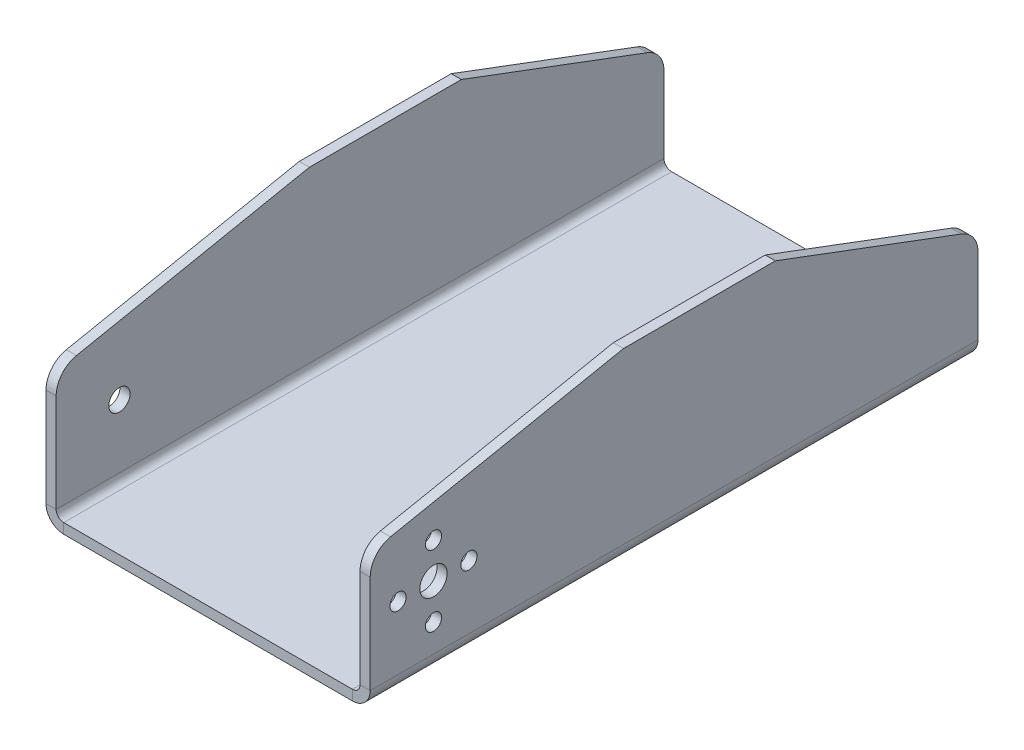
ISO-10303-21;
HEADER;
FILE_DESCRIPTION(('STEP AP214'),'2;1');
FILE_NAME('part.step','',(''),(''),'','','');
FILE_SCHEMA(('AUTOMOTIVE_DESIGN { 1 0 10303 214 1 1 1 1 }'));
ENDSEC;
DATA;
#1=APPLICATION_CONTEXT('core data for automotive mechanical design processes');
#2=APPLICATION_PROTOCOL_DEFINITION('international standard','automotive_design',2000,#1);
#3=PRODUCT_CONTEXT('',#1,'mechanical');
#4=PRODUCT('Part','Part','',(#3));
#5=PRODUCT_RELATED_PRODUCT_CATEGORY('part','',(#4));
#6=PRODUCT_DEFINITION_FORMATION('','',#4);
#7=PRODUCT_DEFINITION_CONTEXT('part definition',#1,'design');
#8=PRODUCT_DEFINITION('design','',#6,#7);
#9=PRODUCT_DEFINITION_SHAPE('','',#8);
#10=(LENGTH_UNIT() NAMED_UNIT(*) SI_UNIT(.MILLI.,.METRE.));
#11=(NAMED_UNIT(*) PLANE_ANGLE_UNIT() SI_UNIT($,.RADIAN.));
#12=(NAMED_UNIT(*) SI_UNIT($,.STERADIAN.) SOLID_ANGLE_UNIT());
#13=UNCERTAINTY_MEASURE_WITH_UNIT(LENGTH_MEASURE(1.E-05),#10,'distance_accuracy_value','');
#14=(GEOMETRIC_REPRESENTATION_CONTEXT(3) GLOBAL_UNCERTAINTY_ASSIGNED_CONTEXT((#13)) GLOBAL_UNIT_ASSIGNED_CONTEXT((#10,
#11,#12)) REPRESENTATION_CONTEXT('',''));
#15=CARTESIAN_POINT('',(0.,0.,0.));
#16=DIRECTION('',(0.,0.,1.));
#17=DIRECTION('',(1.,0.,0.));
#18=AXIS2_PLACEMENT_3D('',#15,#16,#17);
#19=CARTESIAN_POINT('',(-28.5,-17.5,120.));
#20=DIRECTION('',(0.,0.,1.));
#21=DIRECTION('',(1.,0.,0.));
#22=AXIS2_PLACEMENT_3D('',#19,#20,#21);
#23=PLANE('',#22);
#24=DIRECTION('',(0.,-1.,0.));
#25=VECTOR('',#24,1.);
#26=CARTESIAN_POINT('',(-28.5,-17.5,120.));
#27=LINE('',#26,#25);
#28=CARTESIAN_POINT('',(-28.5,-17.5,120.));
#29=VERTEX_POINT('',#28);
#30=CARTESIAN_POINT('',(-28.5,-19.5,120.));
#31=VERTEX_POINT('',#30);
#32=EDGE_CURVE('E300',#29,#31,#27,.T.);
#33=ORIENTED_EDGE('',*,*,#32,.F.);
#34=CARTESIAN_POINT('',(-28.5,-16.,120.));
#35=DIRECTION('',(0.,0.,-1.));
#36=DIRECTION('',(-1.,0.,0.));
#37=AXIS2_PLACEMENT_3D('',#34,#35,#36);
#38=CIRCLE('',#37,1.5);
#39=CARTESIAN_POINT('',(-30.,-16.,120.));
#40=VERTEX_POINT('',#39);
#41=EDGE_CURVE('E215',#40,#29,#38,.F.);
#42=ORIENTED_EDGE('',*,*,#41,.F.);
#43=DIRECTION('',(1.,0.,0.));
#44=VECTOR('',#43,1.);
#45=CARTESIAN_POINT('',(-32.,-16.,120.));
#46=LINE('',#45,#44);
#47=CARTESIAN_POINT('',(-32.,-16.,120.));
#48=VERTEX_POINT('',#47);
#49=EDGE_CURVE('E297',#48,#40,#46,.T.);
#50=ORIENTED_EDGE('',*,*,#49,.F.);
#51=CARTESIAN_POINT('',(-28.5,-16.,120.));
#52=DIRECTION('',(0.,0.,1.));
#53=DIRECTION('',(1.,0.,0.));
#54=AXIS2_PLACEMENT_3D('',#51,#52,#53);
#55=CIRCLE('',#54,3.5);
#56=EDGE_CURVE('E225',#48,#31,#55,.T.);
#57=ORIENTED_EDGE('',*,*,#56,.T.);
#58=EDGE_LOOP('',(#33,#42,#50,#57));
#59=FACE_BOUND('',#58,.T.);
#60=ADVANCED_FACE('F41',(#59),#23,.T.);
#61=CARTESIAN_POINT('',(-32.,-16.,120.));
#62=DIRECTION('',(0.,0.,1.));
#63=DIRECTION('',(1.,0.,0.));
#64=AXIS2_PLACEMENT_3D('',#61,#62,#63);
#65=PLANE('',#64);
#66=DIRECTION('',(1.,0.,0.));
#67=VECTOR('',#66,1.);
#68=CARTESIAN_POINT('',(-30.,-17.5,120.));
#69=LINE('',#68,#67);
#70=CARTESIAN_POINT('',(28.5,-17.5,120.));
#71=VERTEX_POINT('',#70);
#72=EDGE_CURVE('E213',#29,#71,#69,.T.);
#73=ORIENTED_EDGE('',*,*,#72,.F.);
#74=ORIENTED_EDGE('',*,*,#32,.T.);
#75=DIRECTION('',(1.,0.,0.));
#76=VECTOR('',#75,1.);
#77=CARTESIAN_POINT('',(-30.,-19.5,120.));
#78=LINE('',#77,#76);
#79=CARTESIAN_POINT('',(28.5,-19.5,120.));
#80=VERTEX_POINT('',#79);
#81=EDGE_CURVE('E228',#31,#80,#78,.T.);
#82=ORIENTED_EDGE('',*,*,#81,.T.);
#83=DIRECTION('',(0.,1.,0.));
#84=VECTOR('',#83,1.);
#85=CARTESIAN_POINT('',(28.5,-19.5,120.));
#86=LINE('',#85,#84);
#87=EDGE_CURVE('E190',#80,#71,#86,.T.);
#88=ORIENTED_EDGE('',*,*,#87,.T.);
#89=EDGE_LOOP('',(#73,#74,#82,#88));
#90=FACE_BOUND('',#89,.T.);
#91=ADVANCED_FACE('F425',(#90),#65,.T.);
#92=CARTESIAN_POINT('',(-30.,-16.,0.));
#93=DIRECTION('',(0.,0.,-1.));
#94=DIRECTION('',(-1.,0.,0.));
#95=AXIS2_PLACEMENT_3D('',#92,#93,#94);
#96=PLANE('',#95);
#97=DIRECTION('',(-1.,0.,0.));
#98=VECTOR('',#97,1.);
#99=CARTESIAN_POINT('',(-30.,-16.,0.));
#100=LINE('',#99,#98);
#101=CARTESIAN_POINT('',(-30.,-16.,0.));
#102=VERTEX_POINT('',#101);
#103=CARTESIAN_POINT('',(-32.,-16.,0.));
#104=VERTEX_POINT('',#103);
#105=EDGE_CURVE('E294',#102,#104,#100,.T.);
#106=ORIENTED_EDGE('',*,*,#105,.F.);
#107=CARTESIAN_POINT('',(-28.5,-16.,0.));
#108=DIRECTION('',(0.,0.,-1.));
#109=DIRECTION('',(-1.,0.,0.));
#110=AXIS2_PLACEMENT_3D('',#107,#108,#109);
#111=CIRCLE('',#110,1.5);
#112=CARTESIAN_POINT('',(-28.5,-17.5,0.));
#113=VERTEX_POINT('',#112);
#114=EDGE_CURVE('E243',#102,#113,#111,.F.);
#115=ORIENTED_EDGE('',*,*,#114,.T.);
#116=DIRECTION('',(0.,1.,0.));
#117=VECTOR('',#116,1.);
#118=CARTESIAN_POINT('',(-28.5,-19.5,0.));
#119=LINE('',#118,#117);
#120=CARTESIAN_POINT('',(-28.5,-19.5,0.));
#121=VERTEX_POINT('',#120);
#122=EDGE_CURVE('E189',#121,#113,#119,.T.);
#123=ORIENTED_EDGE('',*,*,#122,.F.);
#124=CARTESIAN_POINT('',(-28.5,-16.,0.));
#125=DIRECTION('',(0.,0.,1.));
#126=DIRECTION('',(1.,0.,0.));
#127=AXIS2_PLACEMENT_3D('',#124,#125,#126);
#128=CIRCLE('',#127,3.5);
#129=EDGE_CURVE('E250',#104,#121,#128,.T.);
#130=ORIENTED_EDGE('',*,*,#129,.F.);
#131=EDGE_LOOP('',(#106,#115,#123,#130));
#132=FACE_BOUND('',#131,.T.);
#133=ADVANCED_FACE('F410',(#132),#96,.T.);
#134=CARTESIAN_POINT('',(-28.5,-19.5,0.));
#135=DIRECTION('',(0.,0.,-1.));
#136=DIRECTION('',(-1.,0.,0.));
#137=AXIS2_PLACEMENT_3D('',#134,#135,#136);
#138=PLANE('',#137);
#139=DIRECTION('',(0.,-1.,0.));
#140=VECTOR('',#139,1.);
#141=CARTESIAN_POINT('',(-32.,17.5,0.));
#142=LINE('',#141,#140);
#143=CARTESIAN_POINT('',(-32.,-0.96500234082349,0.));
#144=VERTEX_POINT('',#143);
#145=EDGE_CURVE('E248',#144,#104,#142,.T.);
#146=ORIENTED_EDGE('',*,*,#145,.F.);
#147=DIRECTION('',(-1.,0.,0.));
#148=VECTOR('',#147,1.);
#149=CARTESIAN_POINT('',(-28.5,-0.96500234082349,0.));
#150=LINE('',#149,#148);
#151=CARTESIAN_POINT('',(-30.,-0.96500234082349,0.));
#152=VERTEX_POINT('',#151);
#153=EDGE_CURVE('E331',#144,#152,#150,.F.);
#154=ORIENTED_EDGE('',*,*,#153,.T.);
#155=DIRECTION('',(0.,-1.,0.));
#156=VECTOR('',#155,1.);
#157=CARTESIAN_POINT('',(-30.,17.5,0.));
#158=LINE('',#157,#156);
#159=EDGE_CURVE('E246',#152,#102,#158,.T.);
#160=ORIENTED_EDGE('',*,*,#159,.T.);
#161=ORIENTED_EDGE('',*,*,#105,.T.);
#162=EDGE_LOOP('',(#146,#154,#160,#161));
#163=FACE_BOUND('',#162,.T.);
#164=ADVANCED_FACE('F407',(#163),#138,.T.);
#165=CARTESIAN_POINT('',(30.,-16.,120.));
#166=DIRECTION('',(0.,0.,1.));
#167=DIRECTION('',(1.,0.,0.));
#168=AXIS2_PLACEMENT_3D('',#165,#166,#167);
#169=PLANE('',#168);
#170=DIRECTION('',(1.,0.,0.));
#171=VECTOR('',#170,1.);
#172=CARTESIAN_POINT('',(30.,-16.,120.));
#173=LINE('',#172,#171);
#174=CARTESIAN_POINT('',(30.,-16.,120.));
#175=VERTEX_POINT('',#174);
#176=CARTESIAN_POINT('',(32.,-16.,120.));
#177=VERTEX_POINT('',#176);
#178=EDGE_CURVE('E177',#175,#177,#173,.T.);
#179=ORIENTED_EDGE('',*,*,#178,.F.);
#180=CARTESIAN_POINT('',(28.5,-16.,120.));
#181=DIRECTION('',(0.,0.,-1.));
#182=DIRECTION('',(-1.,0.,0.));
#183=AXIS2_PLACEMENT_3D('',#180,#181,#182);
#184=CIRCLE('',#183,1.5);
#185=EDGE_CURVE('E181',#71,#175,#184,.F.);
#186=ORIENTED_EDGE('',*,*,#185,.F.);
#187=ORIENTED_EDGE('',*,*,#87,.F.);
#188=CARTESIAN_POINT('',(28.5,-16.,120.));
#189=DIRECTION('',(0.,0.,1.));
#190=DIRECTION('',(1.,0.,0.));
#191=AXIS2_PLACEMENT_3D('',#188,#189,#190);
#192=CIRCLE('',#191,3.5);
#193=EDGE_CURVE('E184',#80,#177,#192,.T.);
#194=ORIENTED_EDGE('',*,*,#193,.T.);
#195=EDGE_LOOP('',(#179,#186,#187,#194));
#196=FACE_BOUND('',#195,.T.);
#197=ADVANCED_FACE('F179',(#196),#169,.T.);
#198=CARTESIAN_POINT('',(28.5,-19.5,120.));
#199=DIRECTION('',(0.,0.,1.));
#200=DIRECTION('',(1.,0.,0.));
#201=AXIS2_PLACEMENT_3D('',#198,#199,#200);
#202=PLANE('',#201);
#203=DIRECTION('',(0.,1.,0.));
#204=VECTOR('',#203,1.);
#205=CARTESIAN_POINT('',(32.,-17.5,120.));
#206=LINE('',#205,#204);
#207=CARTESIAN_POINT('',(32.,3.40098048640719,120.));
#208=VERTEX_POINT('',#207);
#209=EDGE_CURVE('E208',#177,#208,#206,.T.);
#210=ORIENTED_EDGE('',*,*,#209,.T.);
#211=DIRECTION('',(1.,0.,0.));
#212=VECTOR('',#211,1.);
#213=CARTESIAN_POINT('',(28.5,3.40098048640719,120.));
#214=LINE('',#213,#212);
#215=CARTESIAN_POINT('',(30.,3.40098048640719,120.));
#216=VERTEX_POINT('',#215);
#217=EDGE_CURVE('E207',#208,#216,#214,.F.);
#218=ORIENTED_EDGE('',*,*,#217,.T.);
#219=DIRECTION('',(0.,1.,0.));
#220=VECTOR('',#219,1.);
#221=CARTESIAN_POINT('',(30.,-17.5,120.));
#222=LINE('',#221,#220);
#223=EDGE_CURVE('E197',#175,#216,#222,.T.);
#224=ORIENTED_EDGE('',*,*,#223,.F.);
#225=ORIENTED_EDGE('',*,*,#178,.T.);
#226=EDGE_LOOP('',(#210,#218,#224,#225));
#227=FACE_BOUND('',#226,.T.);
#228=ADVANCED_FACE('F206',(#227),#202,.T.);
#229=CARTESIAN_POINT('',(28.5,-17.5,0.));
#230=DIRECTION('',(0.,0.,-1.));
#231=DIRECTION('',(-1.,0.,0.));
#232=AXIS2_PLACEMENT_3D('',#229,#230,#231);
#233=PLANE('',#232);
#234=DIRECTION('',(0.,-1.,0.));
#235=VECTOR('',#234,1.);
#236=CARTESIAN_POINT('',(28.5,-17.5,0.));
#237=LINE('',#236,#235);
#238=CARTESIAN_POINT('',(28.5,-17.5,0.));
#239=VERTEX_POINT('',#238);
#240=CARTESIAN_POINT('',(28.5,-19.5,0.));
#241=VERTEX_POINT('',#240);
#242=EDGE_CURVE('E290',#239,#241,#237,.T.);
#243=ORIENTED_EDGE('',*,*,#242,.F.);
#244=CARTESIAN_POINT('',(28.5,-16.,0.));
#245=DIRECTION('',(0.,0.,-1.));
#246=DIRECTION('',(-1.,0.,0.));
#247=AXIS2_PLACEMENT_3D('',#244,#245,#246);
#248=CIRCLE('',#247,1.5);
#249=CARTESIAN_POINT('',(30.,-16.,0.));
#250=VERTEX_POINT('',#249);
#251=EDGE_CURVE('E238',#239,#250,#248,.F.);
#252=ORIENTED_EDGE('',*,*,#251,.T.);
#253=DIRECTION('',(-1.,0.,0.));
#254=VECTOR('',#253,1.);
#255=CARTESIAN_POINT('',(32.,-16.,0.));
#256=LINE('',#255,#254);
#257=CARTESIAN_POINT('',(32.,-16.,0.));
#258=VERTEX_POINT('',#257);
#259=EDGE_CURVE('E288',#258,#250,#256,.T.);
#260=ORIENTED_EDGE('',*,*,#259,.F.);
#261=CARTESIAN_POINT('',(28.5,-16.,0.));
#262=DIRECTION('',(0.,0.,1.));
#263=DIRECTION('',(1.,0.,0.));
#264=AXIS2_PLACEMENT_3D('',#261,#262,#263);
#265=CIRCLE('',#264,3.5);
#266=EDGE_CURVE('E256',#241,#258,#265,.T.);
#267=ORIENTED_EDGE('',*,*,#266,.F.);
#268=EDGE_LOOP('',(#243,#252,#260,#267));
#269=FACE_BOUND('',#268,.T.);
#270=ADVANCED_FACE('F420',(#269),#233,.T.);
#271=CARTESIAN_POINT('',(32.,-16.,0.));
#272=DIRECTION('',(0.,0.,-1.));
#273=DIRECTION('',(-1.,0.,0.));
#274=AXIS2_PLACEMENT_3D('',#271,#272,#273);
#275=PLANE('',#274);
#276=DIRECTION('',(1.,0.,0.));
#277=VECTOR('',#276,1.);
#278=CARTESIAN_POINT('',(-30.,-17.5,0.));
#279=LINE('',#278,#277);
#280=EDGE_CURVE('E240',#113,#239,#279,.T.);
#281=ORIENTED_EDGE('',*,*,#280,.T.);
#282=ORIENTED_EDGE('',*,*,#242,.T.);
#283=DIRECTION('',(1.,0.,0.));
#284=VECTOR('',#283,1.);
#285=CARTESIAN_POINT('',(-30.,-19.5,0.));
#286=LINE('',#285,#284);
#287=EDGE_CURVE('E253',#121,#241,#286,.T.);
#288=ORIENTED_EDGE('',*,*,#287,.F.);
#289=ORIENTED_EDGE('',*,*,#122,.T.);
#290=EDGE_LOOP('',(#281,#282,#288,#289));
#291=FACE_BOUND('',#290,.T.);
#292=ADVANCED_FACE('F416',(#291),#275,.T.);
#293=CARTESIAN_POINT('',(32.,-17.5,120.));
#294=DIRECTION('',(-1.,0.,0.));
#295=DIRECTION('',(0.,-1.,0.));
#296=AXIS2_PLACEMENT_3D('',#293,#294,#295);
#297=PLANE('',#296);
#298=CARTESIAN_POINT('',(32.,-3.5,107.5));
#299=DIRECTION('',(1.,0.,0.));
#300=DIRECTION('',(0.,1.,0.));
#301=AXIS2_PLACEMENT_3D('',#298,#299,#300);
#302=CIRCLE('',#301,2.70000000000001);
#303=CARTESIAN_POINT('',(32.,-0.799999999999988,107.5));
#304=VERTEX_POINT('',#303);
#305=EDGE_CURVE('E458',#304,#304,#302,.T.);
#306=ORIENTED_EDGE('',*,*,#305,.F.);
#307=EDGE_LOOP('',(#306));
#308=FACE_BOUND('',#307,.T.);
#309=CARTESIAN_POINT('',(32.,3.5,107.5));
#310=DIRECTION('',(1.,0.,0.));
#311=DIRECTION('',(0.,1.,0.));
#312=AXIS2_PLACEMENT_3D('',#309,#310,#311);
#313=CIRCLE('',#312,1.59999999999999);
#314=CARTESIAN_POINT('',(32.,5.09999999999999,107.5));
#315=VERTEX_POINT('',#314);
#316=EDGE_CURVE('E236',#315,#315,#313,.T.);
#317=ORIENTED_EDGE('',*,*,#316,.F.);
#318=EDGE_LOOP('',(#317));
#319=FACE_BOUND('',#318,.T.);
#320=CARTESIAN_POINT('',(32.,-3.49999999999997,100.5));
#321=DIRECTION('',(1.,0.,0.));
#322=DIRECTION('',(0.,1.,0.));
#323=AXIS2_PLACEMENT_3D('',#320,#321,#322);
#324=CIRCLE('',#323,1.59999999999999);
#325=CARTESIAN_POINT('',(32.,-1.89999999999998,100.5));
#326=VERTEX_POINT('',#325);
#327=EDGE_CURVE('E448',#326,#326,#324,.T.);
#328=ORIENTED_EDGE('',*,*,#327,.F.);
#329=EDGE_LOOP('',(#328));
#330=FACE_BOUND('',#329,.T.);
#331=CARTESIAN_POINT('',(32.,-10.5,107.5));
#332=DIRECTION('',(1.,0.,0.));
#333=DIRECTION('',(0.,1.,0.));
#334=AXIS2_PLACEMENT_3D('',#331,#332,#333);
#335=CIRCLE('',#334,1.59999999999999);
#336=CARTESIAN_POINT('',(32.,-8.89999999999999,107.5));
#337=VERTEX_POINT('',#336);
#338=EDGE_CURVE('E442',#337,#337,#335,.T.);
#339=ORIENTED_EDGE('',*,*,#338,.F.);
#340=EDGE_LOOP('',(#339));
#341=FACE_BOUND('',#340,.T.);
#342=CARTESIAN_POINT('',(32.,-3.5,114.5));
#343=DIRECTION('',(1.,0.,0.));
#344=DIRECTION('',(0.,1.,0.));
#345=AXIS2_PLACEMENT_3D('',#342,#343,#344);
#346=CIRCLE('',#345,1.59999999999999);
#347=CARTESIAN_POINT('',(32.,-1.90000000000001,114.5));
#348=VERTEX_POINT('',#347);
#349=EDGE_CURVE('E434',#348,#348,#346,.T.);
#350=ORIENTED_EDGE('',*,*,#349,.F.);
#351=EDGE_LOOP('',(#350));
#352=FACE_BOUND('',#351,.T.);
#353=DIRECTION('',(0.,1.,0.));
#354=VECTOR('',#353,1.);
#355=CARTESIAN_POINT('',(32.,-17.5,0.));
#356=LINE('',#355,#354);
#357=CARTESIAN_POINT('',(32.,-0.96500234082349,0.));
#358=VERTEX_POINT('',#357);
#359=EDGE_CURVE('E233',#258,#358,#356,.T.);
#360=ORIENTED_EDGE('',*,*,#359,.T.);
#361=CARTESIAN_POINT('',(32.,-0.96500234082349,5.));
#362=DIRECTION('',(-1.,0.,0.));
#363=DIRECTION('',(0.,-1.,0.));
#364=AXIS2_PLACEMENT_3D('',#361,#362,#363);
#365=CIRCLE('',#364,5.);
#366=CARTESIAN_POINT('',(32.,3.71664354702174,3.24438279205805));
#367=VERTEX_POINT('',#366);
#368=EDGE_CURVE('E349',#358,#367,#365,.F.);
#369=ORIENTED_EDGE('',*,*,#368,.T.);
#370=DIRECTION('',(0.,-0.351123441588389,-0.936329177569045));
#371=VECTOR('',#370,1.);
#372=CARTESIAN_POINT('',(32.,2.49999999999997,0.));
#373=LINE('',#372,#371);
#374=CARTESIAN_POINT('',(32.,17.5,40.0000000000004));
#375=VERTEX_POINT('',#374);
#376=EDGE_CURVE('E325',#367,#375,#373,.F.);
#377=ORIENTED_EDGE('',*,*,#376,.T.);
#378=DIRECTION('',(0.,0.,-1.));
#379=VECTOR('',#378,1.);
#380=CARTESIAN_POINT('',(32.,17.5,120.));
#381=LINE('',#380,#379);
#382=CARTESIAN_POINT('',(32.,17.5,69.9999999999991));
#383=VERTEX_POINT('',#382);
#384=EDGE_CURVE('E285',#383,#375,#381,.T.);
#385=ORIENTED_EDGE('',*,*,#384,.F.);
#386=DIRECTION('',(0.,0.196116135138181,-0.980580675690921));
#387=VECTOR('',#386,1.);
#388=CARTESIAN_POINT('',(32.,17.5,69.9999999999991));
#389=LINE('',#388,#387);
#390=CARTESIAN_POINT('',(32.,8.3038838648618,115.980580675691));
#391=VERTEX_POINT('',#390);
#392=EDGE_CURVE('E313',#383,#391,#389,.F.);
#393=ORIENTED_EDGE('',*,*,#392,.T.);
#394=CARTESIAN_POINT('',(32.,3.40098048640719,115.));
#395=DIRECTION('',(-1.,0.,0.));
#396=DIRECTION('',(0.,-1.,0.));
#397=AXIS2_PLACEMENT_3D('',#394,#395,#396);
#398=CIRCLE('',#397,5.);
#399=EDGE_CURVE('E347',#391,#208,#398,.F.);
#400=ORIENTED_EDGE('',*,*,#399,.T.);
#401=ORIENTED_EDGE('',*,*,#209,.F.);
#402=DIRECTION('',(0.,0.,-1.));
#403=VECTOR('',#402,1.);
#404=CARTESIAN_POINT('',(32.,-16.,120.));
#405=LINE('',#404,#403);
#406=EDGE_CURVE('E232',#177,#258,#405,.T.);
#407=ORIENTED_EDGE('',*,*,#406,.T.);
#408=EDGE_LOOP('',(#360,#369,#377,#385,#393,#400,#401,#407));
#409=FACE_BOUND('',#408,.T.);
#410=ADVANCED_FACE('F431',(#308,#319,#330,#341,#352,#409),#297,.F.);
#411=CARTESIAN_POINT('',(30.,17.5,120.));
#412=DIRECTION('',(0.,1.,0.));
#413=DIRECTION('',(0.,0.,1.));
#414=AXIS2_PLACEMENT_3D('',#411,#412,#413);
#415=PLANE('',#414);
#416=ORIENTED_EDGE('',*,*,#384,.T.);
#417=DIRECTION('',(-1.,0.,0.));
#418=VECTOR('',#417,1.);
#419=CARTESIAN_POINT('',(30.,17.5,40.0000000000004));
#420=LINE('',#419,#418);
#421=CARTESIAN_POINT('',(30.,17.5,40.0000000000004));
#422=VERTEX_POINT('',#421);
#423=EDGE_CURVE('E327',#375,#422,#420,.T.);
#424=ORIENTED_EDGE('',*,*,#423,.T.);
#425=DIRECTION('',(0.,0.,-1.));
#426=VECTOR('',#425,1.);
#427=CARTESIAN_POINT('',(30.,17.5,120.));
#428=LINE('',#427,#426);
#429=CARTESIAN_POINT('',(30.,17.5,69.9999999999991));
#430=VERTEX_POINT('',#429);
#431=EDGE_CURVE('E203',#430,#422,#428,.T.);
#432=ORIENTED_EDGE('',*,*,#431,.F.);
#433=DIRECTION('',(1.,0.,0.));
#434=VECTOR('',#433,1.);
#435=CARTESIAN_POINT('',(30.,17.5,69.9999999999991));
#436=LINE('',#435,#434);
#437=EDGE_CURVE('E310',#430,#383,#436,.T.);
#438=ORIENTED_EDGE('',*,*,#437,.T.);
#439=EDGE_LOOP('',(#416,#424,#432,#438));
#440=FACE_BOUND('',#439,.T.);
#441=ADVANCED_FACE('F534',(#440),#415,.T.);
#442=CARTESIAN_POINT('',(30.,-17.5,120.));
#443=DIRECTION('',(-1.,0.,0.));
#444=DIRECTION('',(0.,-1.,0.));
#445=AXIS2_PLACEMENT_3D('',#442,#443,#444);
#446=PLANE('',#445);
#447=CARTESIAN_POINT('',(30.,-3.5,107.5));
#448=DIRECTION('',(1.,0.,0.));
#449=DIRECTION('',(0.,1.,0.));
#450=AXIS2_PLACEMENT_3D('',#447,#448,#449);
#451=CIRCLE('',#450,2.70000000000001);
#452=CARTESIAN_POINT('',(30.,-0.799999999999988,107.5));
#453=VERTEX_POINT('',#452);
#454=EDGE_CURVE('E441',#453,#453,#451,.T.);
#455=ORIENTED_EDGE('',*,*,#454,.T.);
#456=EDGE_LOOP('',(#455));
#457=FACE_BOUND('',#456,.T.);
#458=CARTESIAN_POINT('',(30.,3.5,107.5));
#459=DIRECTION('',(-1.,0.,0.));
#460=DIRECTION('',(0.,-1.,0.));
#461=AXIS2_PLACEMENT_3D('',#458,#459,#460);
#462=CIRCLE('',#461,1.59999999999999);
#463=CARTESIAN_POINT('',(30.,1.90000000000001,107.5));
#464=VERTEX_POINT('',#463);
#465=EDGE_CURVE('E451',#464,#464,#462,.F.);
#466=ORIENTED_EDGE('',*,*,#465,.T.);
#467=EDGE_LOOP('',(#466));
#468=FACE_BOUND('',#467,.T.);
#469=CARTESIAN_POINT('',(30.,-3.49999999999997,100.5));
#470=DIRECTION('',(-1.,0.,0.));
#471=DIRECTION('',(0.,-1.,0.));
#472=AXIS2_PLACEMENT_3D('',#469,#470,#471);
#473=CIRCLE('',#472,1.59999999999999);
#474=CARTESIAN_POINT('',(30.,-5.09999999999996,100.5));
#475=VERTEX_POINT('',#474);
#476=EDGE_CURVE('E445',#475,#475,#473,.F.);
#477=ORIENTED_EDGE('',*,*,#476,.T.);
#478=EDGE_LOOP('',(#477));
#479=FACE_BOUND('',#478,.T.);
#480=CARTESIAN_POINT('',(30.,-10.5,107.5));
#481=DIRECTION('',(-1.,0.,0.));
#482=DIRECTION('',(0.,-1.,0.));
#483=AXIS2_PLACEMENT_3D('',#480,#481,#482);
#484=CIRCLE('',#483,1.59999999999999);
#485=CARTESIAN_POINT('',(30.,-12.1,107.5));
#486=VERTEX_POINT('',#485);
#487=EDGE_CURVE('E437',#486,#486,#484,.F.);
#488=ORIENTED_EDGE('',*,*,#487,.T.);
#489=EDGE_LOOP('',(#488));
#490=FACE_BOUND('',#489,.T.);
#491=CARTESIAN_POINT('',(30.,-3.5,114.5));
#492=DIRECTION('',(-1.,0.,0.));
#493=DIRECTION('',(0.,-1.,0.));
#494=AXIS2_PLACEMENT_3D('',#491,#492,#493);
#495=CIRCLE('',#494,1.59999999999999);
#496=CARTESIAN_POINT('',(30.,-5.09999999999999,114.5));
#497=VERTEX_POINT('',#496);
#498=EDGE_CURVE('E438',#497,#497,#495,.F.);
#499=ORIENTED_EDGE('',*,*,#498,.T.);
#500=EDGE_LOOP('',(#499));
#501=FACE_BOUND('',#500,.T.);
#502=DIRECTION('',(0.,0.351123441588389,0.936329177569045));
#503=VECTOR('',#502,1.);
#504=CARTESIAN_POINT('',(30.,39.4863013698628,98.6301369863016));
#505=LINE('',#504,#503);
#506=CARTESIAN_POINT('',(30.,3.71664354702173,3.24438279205803));
#507=VERTEX_POINT('',#506);
#508=EDGE_CURVE('E329',#422,#507,#505,.F.);
#509=ORIENTED_EDGE('',*,*,#508,.T.);
#510=CARTESIAN_POINT('',(30.,-0.96500234082349,5.));
#511=DIRECTION('',(-1.,0.,0.));
#512=DIRECTION('',(0.,-1.,0.));
#513=AXIS2_PLACEMENT_3D('',#510,#511,#512);
#514=CIRCLE('',#513,5.);
#515=CARTESIAN_POINT('',(30.,-0.96500234082349,0.));
#516=VERTEX_POINT('',#515);
#517=EDGE_CURVE('E354',#507,#516,#514,.T.);
#518=ORIENTED_EDGE('',*,*,#517,.T.);
#519=DIRECTION('',(0.,1.,0.));
#520=VECTOR('',#519,1.);
#521=CARTESIAN_POINT('',(30.,-17.5,0.));
#522=LINE('',#521,#520);
#523=EDGE_CURVE('E199',#250,#516,#522,.T.);
#524=ORIENTED_EDGE('',*,*,#523,.F.);
#525=DIRECTION('',(0.,0.,-1.));
#526=VECTOR('',#525,1.);
#527=CARTESIAN_POINT('',(30.,-16.,120.));
#528=LINE('',#527,#526);
#529=EDGE_CURVE('E194',#175,#250,#528,.T.);
#530=ORIENTED_EDGE('',*,*,#529,.F.);
#531=ORIENTED_EDGE('',*,*,#223,.T.);
#532=CARTESIAN_POINT('',(30.,3.40098048640719,115.));
#533=DIRECTION('',(-1.,0.,0.));
#534=DIRECTION('',(0.,-1.,0.));
#535=AXIS2_PLACEMENT_3D('',#532,#533,#534);
#536=CIRCLE('',#535,5.);
#537=CARTESIAN_POINT('',(30.,8.3038838648618,115.980580675691));
#538=VERTEX_POINT('',#537);
#539=EDGE_CURVE('E56',#216,#538,#536,.T.);
#540=ORIENTED_EDGE('',*,*,#539,.T.);
#541=DIRECTION('',(0.,-0.196116135138181,0.980580675690921));
#542=VECTOR('',#541,1.);
#543=CARTESIAN_POINT('',(30.,6.53846153846156,124.807692307692));
#544=LINE('',#543,#542);
#545=EDGE_CURVE('E316',#538,#430,#544,.F.);
#546=ORIENTED_EDGE('',*,*,#545,.T.);
#547=ORIENTED_EDGE('',*,*,#431,.T.);
#548=EDGE_LOOP('',(#509,#518,#524,#530,#531,#540,#546,#547));
#549=FACE_BOUND('',#548,.T.);
#550=ADVANCED_FACE('F196',(#457,#468,#479,#490,#501,#549),#446,.T.);
#551=CARTESIAN_POINT('',(28.5,-16.,120.));
#552=DIRECTION('',(0.,0.,-1.));
#553=DIRECTION('',(-1.,0.,0.));
#554=AXIS2_PLACEMENT_3D('',#551,#552,#553);
#555=CYLINDRICAL_SURFACE('',#554,1.5);
#556=ORIENTED_EDGE('',*,*,#251,.F.);
#557=DIRECTION('',(0.,0.,-1.));
#558=VECTOR('',#557,1.);
#559=CARTESIAN_POINT('',(28.5,-17.5,120.));
#560=LINE('',#559,#558);
#561=EDGE_CURVE('E204',#71,#239,#560,.T.);
#562=ORIENTED_EDGE('',*,*,#561,.F.);
#563=ORIENTED_EDGE('',*,*,#185,.T.);
#564=ORIENTED_EDGE('',*,*,#529,.T.);
#565=EDGE_LOOP('',(#556,#562,#563,#564));
#566=FACE_BOUND('',#565,.T.);
#567=ADVANCED_FACE('F211',(#566),#555,.F.);
#568=CARTESIAN_POINT('',(-30.,-17.5,120.));
#569=DIRECTION('',(0.,1.,0.));
#570=DIRECTION('',(0.,0.,1.));
#571=AXIS2_PLACEMENT_3D('',#568,#569,#570);
#572=PLANE('',#571);
#573=ORIENTED_EDGE('',*,*,#280,.F.);
#574=DIRECTION('',(0.,0.,-1.));
#575=VECTOR('',#574,1.);
#576=CARTESIAN_POINT('',(-28.5,-17.5,120.));
#577=LINE('',#576,#575);
#578=EDGE_CURVE('E279',#29,#113,#577,.T.);
#579=ORIENTED_EDGE('',*,*,#578,.F.);
#580=ORIENTED_EDGE('',*,*,#72,.T.);
#581=ORIENTED_EDGE('',*,*,#561,.T.);
#582=EDGE_LOOP('',(#573,#579,#580,#581));
#583=FACE_BOUND('',#582,.T.);
#584=ADVANCED_FACE('F422',(#583),#572,.T.);
#585=CARTESIAN_POINT('',(-28.5,-16.,120.));
#586=DIRECTION('',(0.,0.,-1.));
#587=DIRECTION('',(-1.,0.,0.));
#588=AXIS2_PLACEMENT_3D('',#585,#586,#587);
#589=CYLINDRICAL_SURFACE('',#588,1.5);
#590=ORIENTED_EDGE('',*,*,#114,.F.);
#591=DIRECTION('',(0.,0.,-1.));
#592=VECTOR('',#591,1.);
#593=CARTESIAN_POINT('',(-30.,-16.,120.));
#594=LINE('',#593,#592);
#595=EDGE_CURVE('E276',#40,#102,#594,.T.);
#596=ORIENTED_EDGE('',*,*,#595,.F.);
#597=ORIENTED_EDGE('',*,*,#41,.T.);
#598=ORIENTED_EDGE('',*,*,#578,.T.);
#599=EDGE_LOOP('',(#590,#596,#597,#598));
#600=FACE_BOUND('',#599,.T.);
#601=ADVANCED_FACE('F384',(#600),#589,.F.);
#602=CARTESIAN_POINT('',(-30.,17.5,120.));
#603=DIRECTION('',(1.,0.,0.));
#604=DIRECTION('',(0.,1.,0.));
#605=AXIS2_PLACEMENT_3D('',#602,#603,#604);
#606=PLANE('',#605);
#607=CARTESIAN_POINT('',(-30.,-3.50000000000001,107.5));
#608=DIRECTION('',(-1.,0.,0.));
#609=DIRECTION('',(0.,-1.,0.));
#610=AXIS2_PLACEMENT_3D('',#607,#608,#609);
#611=CIRCLE('',#610,2.1);
#612=CARTESIAN_POINT('',(-30.,-5.60000000000001,107.5));
#613=VERTEX_POINT('',#612);
#614=EDGE_CURVE('E461',#613,#613,#611,.T.);
#615=ORIENTED_EDGE('',*,*,#614,.T.);
#616=EDGE_LOOP('',(#615));
#617=FACE_BOUND('',#616,.T.);
#618=ORIENTED_EDGE('',*,*,#159,.F.);
#619=CARTESIAN_POINT('',(-30.,-0.96500234082349,5.));
#620=DIRECTION('',(1.,0.,0.));
#621=DIRECTION('',(0.,1.,0.));
#622=AXIS2_PLACEMENT_3D('',#619,#620,#621);
#623=CIRCLE('',#622,5.);
#624=CARTESIAN_POINT('',(-30.,3.71664354702173,3.24438279205803));
#625=VERTEX_POINT('',#624);
#626=EDGE_CURVE('E336',#152,#625,#623,.T.);
#627=ORIENTED_EDGE('',*,*,#626,.T.);
#628=DIRECTION('',(0.,-0.351123441588389,-0.936329177569045));
#629=VECTOR('',#628,1.);
#630=CARTESIAN_POINT('',(-30.,43.8013698630134,110.13698630137));
#631=LINE('',#630,#629);
#632=CARTESIAN_POINT('',(-30.,17.5,40.0000000000004));
#633=VERTEX_POINT('',#632);
#634=EDGE_CURVE('E318',#625,#633,#631,.F.);
#635=ORIENTED_EDGE('',*,*,#634,.T.);
#636=DIRECTION('',(0.,0.,-1.));
#637=VECTOR('',#636,1.);
#638=CARTESIAN_POINT('',(-30.,17.5,120.));
#639=LINE('',#638,#637);
#640=CARTESIAN_POINT('',(-30.,17.5,69.9999999999991));
#641=VERTEX_POINT('',#640);
#642=EDGE_CURVE('E273',#641,#633,#639,.T.);
#643=ORIENTED_EDGE('',*,*,#642,.F.);
#644=DIRECTION('',(0.,-0.196116135138181,0.980580675690921));
#645=VECTOR('',#644,1.);
#646=CARTESIAN_POINT('',(-30.,7.88461538461537,118.076923076923));
#647=LINE('',#646,#645);
#648=CARTESIAN_POINT('',(-30.,8.3038838648618,115.980580675691));
#649=VERTEX_POINT('',#648);
#650=EDGE_CURVE('E305',#641,#649,#647,.T.);
#651=ORIENTED_EDGE('',*,*,#650,.T.);
#652=CARTESIAN_POINT('',(-30.,3.4009804864072,115.));
#653=DIRECTION('',(1.,0.,0.));
#654=DIRECTION('',(0.,1.,0.));
#655=AXIS2_PLACEMENT_3D('',#652,#653,#654);
#656=CIRCLE('',#655,5.);
#657=CARTESIAN_POINT('',(-30.,3.4009804864072,120.));
#658=VERTEX_POINT('',#657);
#659=EDGE_CURVE('E334',#649,#658,#656,.T.);
#660=ORIENTED_EDGE('',*,*,#659,.T.);
#661=DIRECTION('',(0.,-1.,0.));
#662=VECTOR('',#661,1.);
#663=CARTESIAN_POINT('',(-30.,17.5,120.));
#664=LINE('',#663,#662);
#665=EDGE_CURVE('E221',#658,#40,#664,.T.);
#666=ORIENTED_EDGE('',*,*,#665,.T.);
#667=ORIENTED_EDGE('',*,*,#595,.T.);
#668=EDGE_LOOP('',(#618,#627,#635,#643,#651,#660,#666,#667));
#669=FACE_BOUND('',#668,.T.);
#670=ADVANCED_FACE('F387',(#617,#669),#606,.T.);
#671=CARTESIAN_POINT('',(-32.,17.5,120.));
#672=DIRECTION('',(0.,1.,0.));
#673=DIRECTION('',(0.,0.,1.));
#674=AXIS2_PLACEMENT_3D('',#671,#672,#673);
#675=PLANE('',#674);
#676=ORIENTED_EDGE('',*,*,#642,.T.);
#677=DIRECTION('',(-1.,0.,0.));
#678=VECTOR('',#677,1.);
#679=CARTESIAN_POINT('',(-32.,17.5,40.0000000000004));
#680=LINE('',#679,#678);
#681=CARTESIAN_POINT('',(-32.,17.5,40.0000000000004));
#682=VERTEX_POINT('',#681);
#683=EDGE_CURVE('E320',#633,#682,#680,.T.);
#684=ORIENTED_EDGE('',*,*,#683,.T.);
#685=DIRECTION('',(0.,0.,-1.));
#686=VECTOR('',#685,1.);
#687=CARTESIAN_POINT('',(-32.,17.5,120.));
#688=LINE('',#687,#686);
#689=CARTESIAN_POINT('',(-32.,17.5,69.9999999999991));
#690=VERTEX_POINT('',#689);
#691=EDGE_CURVE('E270',#690,#682,#688,.T.);
#692=ORIENTED_EDGE('',*,*,#691,.F.);
#693=DIRECTION('',(1.,0.,0.));
#694=VECTOR('',#693,1.);
#695=CARTESIAN_POINT('',(-30.,17.5,69.9999999999991));
#696=LINE('',#695,#694);
#697=EDGE_CURVE('E302',#690,#641,#696,.T.);
#698=ORIENTED_EDGE('',*,*,#697,.T.);
#699=EDGE_LOOP('',(#676,#684,#692,#698));
#700=FACE_BOUND('',#699,.T.);
#701=ADVANCED_FACE('F396',(#700),#675,.T.);
#702=CARTESIAN_POINT('',(-32.,17.5,120.));
#703=DIRECTION('',(1.,0.,0.));
#704=DIRECTION('',(0.,1.,0.));
#705=AXIS2_PLACEMENT_3D('',#702,#703,#704);
#706=PLANE('',#705);
#707=CARTESIAN_POINT('',(-32.,-3.50000000000001,107.5));
#708=DIRECTION('',(-1.,0.,0.));
#709=DIRECTION('',(0.,-1.,0.));
#710=AXIS2_PLACEMENT_3D('',#707,#708,#709);
#711=CIRCLE('',#710,2.1);
#712=CARTESIAN_POINT('',(-32.,-5.60000000000001,107.5));
#713=VERTEX_POINT('',#712);
#714=EDGE_CURVE('E464',#713,#713,#711,.T.);
#715=ORIENTED_EDGE('',*,*,#714,.F.);
#716=EDGE_LOOP('',(#715));
#717=FACE_BOUND('',#716,.T.);
#718=DIRECTION('',(0.,0.351123441588389,0.936329177569045));
#719=VECTOR('',#718,1.);
#720=CARTESIAN_POINT('',(-32.,2.49999999999997,0.));
#721=LINE('',#720,#719);
#722=CARTESIAN_POINT('',(-32.,3.71664354702174,3.24438279205805));
#723=VERTEX_POINT('',#722);
#724=EDGE_CURVE('E322',#682,#723,#721,.F.);
#725=ORIENTED_EDGE('',*,*,#724,.T.);
#726=CARTESIAN_POINT('',(-32.,-0.96500234082349,5.));
#727=DIRECTION('',(1.,0.,0.));
#728=DIRECTION('',(0.,1.,0.));
#729=AXIS2_PLACEMENT_3D('',#726,#727,#728);
#730=CIRCLE('',#729,5.);
#731=EDGE_CURVE('E342',#723,#144,#730,.F.);
#732=ORIENTED_EDGE('',*,*,#731,.T.);
#733=ORIENTED_EDGE('',*,*,#145,.T.);
#734=DIRECTION('',(0.,0.,-1.));
#735=VECTOR('',#734,1.);
#736=CARTESIAN_POINT('',(-32.,-16.,120.));
#737=LINE('',#736,#735);
#738=EDGE_CURVE('E267',#48,#104,#737,.T.);
#739=ORIENTED_EDGE('',*,*,#738,.F.);
#740=DIRECTION('',(0.,-1.,0.));
#741=VECTOR('',#740,1.);
#742=CARTESIAN_POINT('',(-32.,17.5,120.));
#743=LINE('',#742,#741);
#744=CARTESIAN_POINT('',(-32.,3.4009804864072,120.));
#745=VERTEX_POINT('',#744);
#746=EDGE_CURVE('E223',#745,#48,#743,.T.);
#747=ORIENTED_EDGE('',*,*,#746,.F.);
#748=CARTESIAN_POINT('',(-32.,3.4009804864072,115.));
#749=DIRECTION('',(1.,0.,0.));
#750=DIRECTION('',(0.,1.,0.));
#751=AXIS2_PLACEMENT_3D('',#748,#749,#750);
#752=CIRCLE('',#751,5.);
#753=CARTESIAN_POINT('',(-32.,8.3038838648618,115.980580675691));
#754=VERTEX_POINT('',#753);
#755=EDGE_CURVE('E340',#745,#754,#752,.F.);
#756=ORIENTED_EDGE('',*,*,#755,.T.);
#757=DIRECTION('',(0.,0.196116135138181,-0.980580675690921));
#758=VECTOR('',#757,1.);
#759=CARTESIAN_POINT('',(-32.,17.5,69.9999999999991));
#760=LINE('',#759,#758);
#761=EDGE_CURVE('E308',#754,#690,#760,.T.);
#762=ORIENTED_EDGE('',*,*,#761,.T.);
#763=ORIENTED_EDGE('',*,*,#691,.T.);
#764=EDGE_LOOP('',(#725,#732,#733,#739,#747,#756,#762,#763));
#765=FACE_BOUND('',#764,.T.);
#766=ADVANCED_FACE('F369',(#717,#765),#706,.F.);
#767=CARTESIAN_POINT('',(-28.5,-16.,120.));
#768=DIRECTION('',(0.,0.,-1.));
#769=DIRECTION('',(-1.,0.,0.));
#770=AXIS2_PLACEMENT_3D('',#767,#768,#769);
#771=CYLINDRICAL_SURFACE('',#770,3.5);
#772=ORIENTED_EDGE('',*,*,#129,.T.);
#773=DIRECTION('',(0.,0.,-1.));
#774=VECTOR('',#773,1.);
#775=CARTESIAN_POINT('',(-28.5,-19.5,120.));
#776=LINE('',#775,#774);
#777=EDGE_CURVE('E264',#31,#121,#776,.T.);
#778=ORIENTED_EDGE('',*,*,#777,.F.);
#779=ORIENTED_EDGE('',*,*,#56,.F.);
#780=ORIENTED_EDGE('',*,*,#738,.T.);
#781=EDGE_LOOP('',(#772,#778,#779,#780));
#782=FACE_BOUND('',#781,.T.);
#783=ADVANCED_FACE('F376',(#782),#771,.T.);
#784=CARTESIAN_POINT('',(-30.,-19.5,120.));
#785=DIRECTION('',(0.,1.,0.));
#786=DIRECTION('',(0.,0.,1.));
#787=AXIS2_PLACEMENT_3D('',#784,#785,#786);
#788=PLANE('',#787);
#789=ORIENTED_EDGE('',*,*,#287,.T.);
#790=DIRECTION('',(0.,0.,-1.));
#791=VECTOR('',#790,1.);
#792=CARTESIAN_POINT('',(28.5,-19.5,120.));
#793=LINE('',#792,#791);
#794=EDGE_CURVE('E261',#80,#241,#793,.T.);
#795=ORIENTED_EDGE('',*,*,#794,.F.);
#796=ORIENTED_EDGE('',*,*,#81,.F.);
#797=ORIENTED_EDGE('',*,*,#777,.T.);
#798=EDGE_LOOP('',(#789,#795,#796,#797));
#799=FACE_BOUND('',#798,.T.);
#800=ADVANCED_FACE('F413',(#799),#788,.F.);
#801=CARTESIAN_POINT('',(28.5,-16.,120.));
#802=DIRECTION('',(0.,0.,-1.));
#803=DIRECTION('',(-1.,0.,0.));
#804=AXIS2_PLACEMENT_3D('',#801,#802,#803);
#805=CYLINDRICAL_SURFACE('',#804,3.5);
#806=ORIENTED_EDGE('',*,*,#266,.T.);
#807=ORIENTED_EDGE('',*,*,#406,.F.);
#808=ORIENTED_EDGE('',*,*,#193,.F.);
#809=ORIENTED_EDGE('',*,*,#794,.T.);
#810=EDGE_LOOP('',(#806,#807,#808,#809));
#811=FACE_BOUND('',#810,.T.);
#812=ADVANCED_FACE('F427',(#811),#805,.T.);
#813=CARTESIAN_POINT('',(28.5,-16.,120.));
#814=DIRECTION('',(0.,0.,-1.));
#815=DIRECTION('',(-1.,0.,0.));
#816=AXIS2_PLACEMENT_3D('',#813,#814,#815);
#817=PLANE('',#816);
#818=ORIENTED_EDGE('',*,*,#665,.F.);
#819=DIRECTION('',(-1.,0.,0.));
#820=VECTOR('',#819,1.);
#821=CARTESIAN_POINT('',(-32.,3.4009804864072,120.));
#822=LINE('',#821,#820);
#823=EDGE_CURVE('E49',#658,#745,#822,.T.);
#824=ORIENTED_EDGE('',*,*,#823,.T.);
#825=ORIENTED_EDGE('',*,*,#746,.T.);
#826=ORIENTED_EDGE('',*,*,#49,.T.);
#827=EDGE_LOOP('',(#818,#824,#825,#826));
#828=FACE_BOUND('',#827,.T.);
#829=ADVANCED_FACE('F363',(#828),#817,.F.);
#830=CARTESIAN_POINT('',(28.5,-16.,0.));
#831=DIRECTION('',(0.,0.,-1.));
#832=DIRECTION('',(-1.,0.,0.));
#833=AXIS2_PLACEMENT_3D('',#830,#831,#832);
#834=PLANE('',#833);
#835=ORIENTED_EDGE('',*,*,#523,.T.);
#836=DIRECTION('',(-1.,0.,0.));
#837=VECTOR('',#836,1.);
#838=CARTESIAN_POINT('',(28.5,-0.96500234082349,0.));
#839=LINE('',#838,#837);
#840=EDGE_CURVE('E344',#516,#358,#839,.F.);
#841=ORIENTED_EDGE('',*,*,#840,.T.);
#842=ORIENTED_EDGE('',*,*,#359,.F.);
#843=ORIENTED_EDGE('',*,*,#259,.T.);
#844=EDGE_LOOP('',(#835,#841,#842,#843));
#845=FACE_BOUND('',#844,.T.);
#846=ADVANCED_FACE('F541',(#845),#834,.T.);
#847=CARTESIAN_POINT('',(-32.001,-3.49999999999999,114.5));
#848=DIRECTION('',(1.,0.,0.));
#849=DIRECTION('',(0.,1.,0.));
#850=AXIS2_PLACEMENT_3D('',#847,#848,#849);
#851=CYLINDRICAL_SURFACE('',#850,1.59999999999999);
#852=ORIENTED_EDGE('',*,*,#498,.F.);
#853=EDGE_LOOP('',(#852));
#854=FACE_BOUND('',#853,.T.);
#855=ORIENTED_EDGE('',*,*,#349,.T.);
#856=EDGE_LOOP('',(#855));
#857=FACE_BOUND('',#856,.T.);
#858=ADVANCED_FACE('F543',(#854,#857),#851,.F.);
#859=CARTESIAN_POINT('',(-32.001,-10.5,107.5));
#860=DIRECTION('',(1.,0.,0.));
#861=DIRECTION('',(0.,1.,0.));
#862=AXIS2_PLACEMENT_3D('',#859,#860,#861);
#863=CYLINDRICAL_SURFACE('',#862,1.59999999999999);
#864=ORIENTED_EDGE('',*,*,#487,.F.);
#865=EDGE_LOOP('',(#864));
#866=FACE_BOUND('',#865,.T.);
#867=ORIENTED_EDGE('',*,*,#338,.T.);
#868=EDGE_LOOP('',(#867));
#869=FACE_BOUND('',#868,.T.);
#870=ADVANCED_FACE('F549',(#866,#869),#863,.F.);
#871=CARTESIAN_POINT('',(-32.001,-3.49999999999996,100.5));
#872=DIRECTION('',(1.,0.,0.));
#873=DIRECTION('',(0.,1.,0.));
#874=AXIS2_PLACEMENT_3D('',#871,#872,#873);
#875=CYLINDRICAL_SURFACE('',#874,1.59999999999999);
#876=ORIENTED_EDGE('',*,*,#476,.F.);
#877=EDGE_LOOP('',(#876));
#878=FACE_BOUND('',#877,.T.);
#879=ORIENTED_EDGE('',*,*,#327,.T.);
#880=EDGE_LOOP('',(#879));
#881=FACE_BOUND('',#880,.T.);
#882=ADVANCED_FACE('F650',(#878,#881),#875,.F.);
#883=CARTESIAN_POINT('',(-32.001,3.50000000000001,107.5));
#884=DIRECTION('',(1.,0.,0.));
#885=DIRECTION('',(0.,1.,0.));
#886=AXIS2_PLACEMENT_3D('',#883,#884,#885);
#887=CYLINDRICAL_SURFACE('',#886,1.59999999999999);
#888=ORIENTED_EDGE('',*,*,#465,.F.);
#889=EDGE_LOOP('',(#888));
#890=FACE_BOUND('',#889,.T.);
#891=ORIENTED_EDGE('',*,*,#316,.T.);
#892=EDGE_LOOP('',(#891));
#893=FACE_BOUND('',#892,.T.);
#894=ADVANCED_FACE('F501',(#890,#893),#887,.F.);
#895=CARTESIAN_POINT('',(-32.,17.5,69.9999999999991));
#896=DIRECTION('',(0.,0.980580675690921,0.196116135138181));
#897=DIRECTION('',(-1.,0.,0.));
#898=AXIS2_PLACEMENT_3D('',#895,#896,#897);
#899=PLANE('',#898);
#900=ORIENTED_EDGE('',*,*,#761,.F.);
#901=DIRECTION('',(-1.,0.,0.));
#902=VECTOR('',#901,1.);
#903=CARTESIAN_POINT('',(-30.,8.3038838648618,115.980580675691));
#904=LINE('',#903,#902);
#905=EDGE_CURVE('E11',#754,#649,#904,.F.);
#906=ORIENTED_EDGE('',*,*,#905,.T.);
#907=ORIENTED_EDGE('',*,*,#650,.F.);
#908=ORIENTED_EDGE('',*,*,#697,.F.);
#909=EDGE_LOOP('',(#900,#906,#907,#908));
#910=FACE_BOUND('',#909,.T.);
#911=ADVANCED_FACE('F391',(#910),#899,.T.);
#912=CARTESIAN_POINT('',(30.,17.5,69.9999999999991));
#913=DIRECTION('',(0.,-0.980580675690921,-0.196116135138181));
#914=DIRECTION('',(1.,0.,0.));
#915=AXIS2_PLACEMENT_3D('',#912,#913,#914);
#916=PLANE('',#915);
#917=ORIENTED_EDGE('',*,*,#545,.F.);
#918=DIRECTION('',(-1.,0.,0.));
#919=VECTOR('',#918,1.);
#920=CARTESIAN_POINT('',(30.,8.3038838648618,115.980580675691));
#921=LINE('',#920,#919);
#922=EDGE_CURVE('E357',#538,#391,#921,.F.);
#923=ORIENTED_EDGE('',*,*,#922,.T.);
#924=ORIENTED_EDGE('',*,*,#392,.F.);
#925=ORIENTED_EDGE('',*,*,#437,.F.);
#926=EDGE_LOOP('',(#917,#923,#924,#925));
#927=FACE_BOUND('',#926,.T.);
#928=ADVANCED_FACE('F500',(#927),#916,.F.);
#929=CARTESIAN_POINT('',(30.,-3.5,107.5));
#930=DIRECTION('',(1.,0.,0.));
#931=DIRECTION('',(0.,1.,0.));
#932=AXIS2_PLACEMENT_3D('',#929,#930,#931);
#933=CYLINDRICAL_SURFACE('',#932,2.70000000000001);
#934=ORIENTED_EDGE('',*,*,#454,.F.);
#935=EDGE_LOOP('',(#934));
#936=FACE_BOUND('',#935,.T.);
#937=ORIENTED_EDGE('',*,*,#305,.T.);
#938=EDGE_LOOP('',(#937));
#939=FACE_BOUND('',#938,.T.);
#940=ADVANCED_FACE('F474',(#936,#939),#933,.F.);
#941=CARTESIAN_POINT('',(-30.,-3.50000000000001,107.5));
#942=DIRECTION('',(-1.,0.,0.));
#943=DIRECTION('',(0.,-1.,0.));
#944=AXIS2_PLACEMENT_3D('',#941,#942,#943);
#945=CYLINDRICAL_SURFACE('',#944,2.1);
#946=ORIENTED_EDGE('',*,*,#614,.F.);
#947=EDGE_LOOP('',(#946));
#948=FACE_BOUND('',#947,.T.);
#949=ORIENTED_EDGE('',*,*,#714,.T.);
#950=EDGE_LOOP('',(#949));
#951=FACE_BOUND('',#950,.T.);
#952=ADVANCED_FACE('F471',(#948,#951),#945,.F.);
#953=CARTESIAN_POINT('',(-28.5,2.49999999999997,0.));
#954=DIRECTION('',(0.,-0.936329177569045,0.351123441588389));
#955=DIRECTION('',(1.,0.,0.));
#956=AXIS2_PLACEMENT_3D('',#953,#954,#955);
#957=PLANE('',#956);
#958=ORIENTED_EDGE('',*,*,#634,.F.);
#959=DIRECTION('',(1.,0.,0.));
#960=VECTOR('',#959,1.);
#961=CARTESIAN_POINT('',(-28.5,3.71664354702174,3.24438279205805));
#962=LINE('',#961,#960);
#963=EDGE_CURVE('E338',#625,#723,#962,.F.);
#964=ORIENTED_EDGE('',*,*,#963,.T.);
#965=ORIENTED_EDGE('',*,*,#724,.F.);
#966=ORIENTED_EDGE('',*,*,#683,.F.);
#967=EDGE_LOOP('',(#958,#964,#965,#966));
#968=FACE_BOUND('',#967,.T.);
#969=ADVANCED_FACE('F400',(#968),#957,.F.);
#970=CARTESIAN_POINT('',(28.5,2.49999999999997,0.));
#971=DIRECTION('',(0.,-0.936329177569045,0.351123441588389));
#972=DIRECTION('',(1.,0.,0.));
#973=AXIS2_PLACEMENT_3D('',#970,#971,#972);
#974=PLANE('',#973);
#975=ORIENTED_EDGE('',*,*,#376,.F.);
#976=DIRECTION('',(1.,0.,0.));
#977=VECTOR('',#976,1.);
#978=CARTESIAN_POINT('',(28.5,3.71664354702174,3.24438279205805));
#979=LINE('',#978,#977);
#980=EDGE_CURVE('E351',#367,#507,#979,.F.);
#981=ORIENTED_EDGE('',*,*,#980,.T.);
#982=ORIENTED_EDGE('',*,*,#508,.F.);
#983=ORIENTED_EDGE('',*,*,#423,.F.);
#984=EDGE_LOOP('',(#975,#981,#982,#983));
#985=FACE_BOUND('',#984,.T.);
#986=ADVANCED_FACE('F513',(#985),#974,.F.);
#987=CARTESIAN_POINT('',(-28.5,-0.96500234082349,5.));
#988=DIRECTION('',(-1.,0.,0.));
#989=DIRECTION('',(0.,0.,1.));
#990=AXIS2_PLACEMENT_3D('',#987,#988,#989);
#991=CYLINDRICAL_SURFACE('',#990,5.);
#992=ORIENTED_EDGE('',*,*,#731,.F.);
#993=ORIENTED_EDGE('',*,*,#963,.F.);
#994=ORIENTED_EDGE('',*,*,#626,.F.);
#995=ORIENTED_EDGE('',*,*,#153,.F.);
#996=EDGE_LOOP('',(#992,#993,#994,#995));
#997=FACE_BOUND('',#996,.T.);
#998=ADVANCED_FACE('F405',(#997),#991,.T.);
#999=CARTESIAN_POINT('',(28.5,-0.96500234082349,5.));
#1000=DIRECTION('',(-1.,0.,0.));
#1001=DIRECTION('',(0.,0.,1.));
#1002=AXIS2_PLACEMENT_3D('',#999,#1000,#1001);
#1003=CYLINDRICAL_SURFACE('',#1002,5.);
#1004=ORIENTED_EDGE('',*,*,#517,.F.);
#1005=ORIENTED_EDGE('',*,*,#980,.F.);
#1006=ORIENTED_EDGE('',*,*,#368,.F.);
#1007=ORIENTED_EDGE('',*,*,#840,.F.);
#1008=EDGE_LOOP('',(#1004,#1005,#1006,#1007));
#1009=FACE_BOUND('',#1008,.T.);
#1010=ADVANCED_FACE('F521',(#1009),#1003,.T.);
#1011=CARTESIAN_POINT('',(28.5,3.40098048640719,115.));
#1012=DIRECTION('',(1.,0.,0.));
#1013=DIRECTION('',(0.,0.,-1.));
#1014=AXIS2_PLACEMENT_3D('',#1011,#1012,#1013);
#1015=CYLINDRICAL_SURFACE('',#1014,5.);
#1016=ORIENTED_EDGE('',*,*,#399,.F.);
#1017=ORIENTED_EDGE('',*,*,#922,.F.);
#1018=ORIENTED_EDGE('',*,*,#539,.F.);
#1019=ORIENTED_EDGE('',*,*,#217,.F.);
#1020=EDGE_LOOP('',(#1016,#1017,#1018,#1019));
#1021=FACE_BOUND('',#1020,.T.);
#1022=ADVANCED_FACE('F523',(#1021),#1015,.T.);
#1023=CARTESIAN_POINT('',(28.5,3.4009804864072,115.));
#1024=DIRECTION('',(1.,0.,0.));
#1025=DIRECTION('',(0.,0.,-1.));
#1026=AXIS2_PLACEMENT_3D('',#1023,#1024,#1025);
#1027=CYLINDRICAL_SURFACE('',#1026,5.);
#1028=ORIENTED_EDGE('',*,*,#659,.F.);
#1029=ORIENTED_EDGE('',*,*,#905,.F.);
#1030=ORIENTED_EDGE('',*,*,#755,.F.);
#1031=ORIENTED_EDGE('',*,*,#823,.F.);
#1032=EDGE_LOOP('',(#1028,#1029,#1030,#1031));
#1033=FACE_BOUND('',#1032,.T.);
#1034=ADVANCED_FACE('F43',(#1033),#1027,.T.);
#1035=CLOSED_SHELL('',(#60,#91,#133,#164,#197,#228,#270,#292,#410,#441,#550,#567,#584,#601,#670,
#701,#766,#783,#800,#812,#829,#846,#858,#870,#882,#894,#911,#928,#940,#952,#969,#986,#998,#1010,
#1022,#1034));
#1036=MANIFOLD_SOLID_BREP('B2',#1035);
#1037=ADVANCED_BREP_SHAPE_REPRESENTATION('',(#18,#1036),#14);
#1038=SHAPE_DEFINITION_REPRESENTATION(#9,#1037);
ENDSEC;
END-ISO-10303-21;
